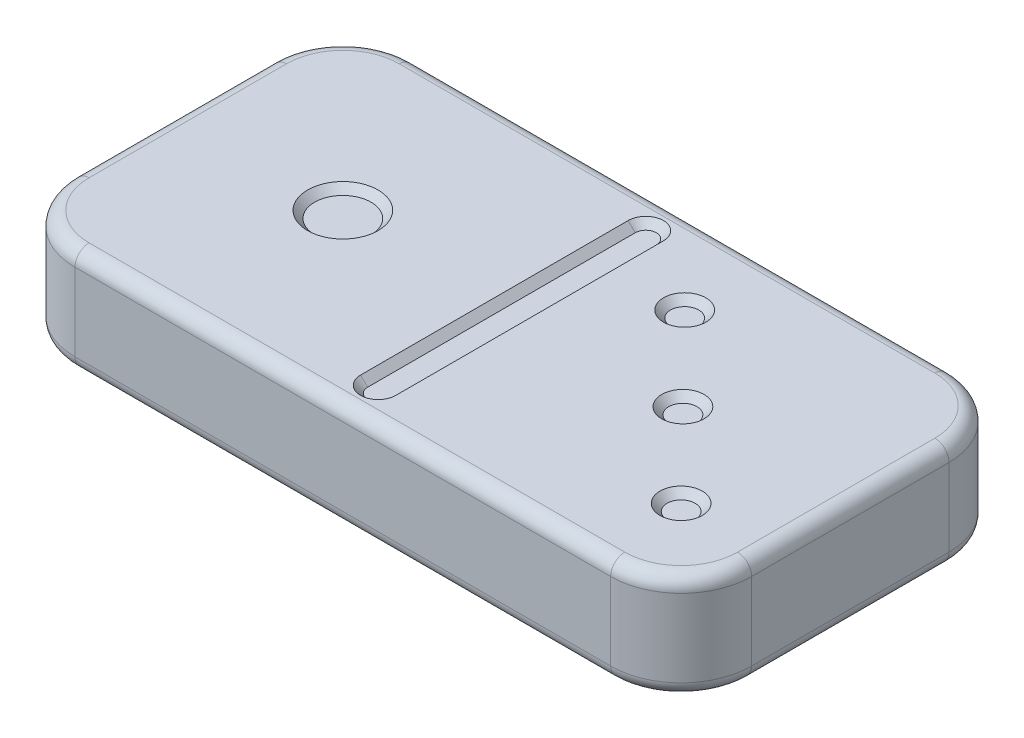
ISO-10303-21;
HEADER;
FILE_DESCRIPTION(('STEP AP214'),'2;1');
FILE_NAME('part.step','',(''),(''),'','','');
FILE_SCHEMA(('AUTOMOTIVE_DESIGN { 1 0 10303 214 1 1 1 1 }'));
ENDSEC;
DATA;
#1=APPLICATION_CONTEXT('core data for automotive mechanical design processes');
#2=APPLICATION_PROTOCOL_DEFINITION('international standard','automotive_design',2000,#1);
#3=PRODUCT_CONTEXT('',#1,'mechanical');
#4=PRODUCT('Part','Part','',(#3));
#5=PRODUCT_RELATED_PRODUCT_CATEGORY('part','',(#4));
#6=PRODUCT_DEFINITION_FORMATION('','',#4);
#7=PRODUCT_DEFINITION_CONTEXT('part definition',#1,'design');
#8=PRODUCT_DEFINITION('design','',#6,#7);
#9=PRODUCT_DEFINITION_SHAPE('','',#8);
#10=(LENGTH_UNIT() NAMED_UNIT(*) SI_UNIT(.MILLI.,.METRE.));
#11=(NAMED_UNIT(*) PLANE_ANGLE_UNIT() SI_UNIT($,.RADIAN.));
#12=(NAMED_UNIT(*) SI_UNIT($,.STERADIAN.) SOLID_ANGLE_UNIT());
#13=UNCERTAINTY_MEASURE_WITH_UNIT(LENGTH_MEASURE(1.E-05),#10,'distance_accuracy_value','');
#14=(GEOMETRIC_REPRESENTATION_CONTEXT(3) GLOBAL_UNCERTAINTY_ASSIGNED_CONTEXT((#13)) GLOBAL_UNIT_ASSIGNED_CONTEXT((#10,
#11,#12)) REPRESENTATION_CONTEXT('',''));
#15=CARTESIAN_POINT('',(0.,0.,0.));
#16=DIRECTION('',(0.,0.,1.));
#17=DIRECTION('',(1.,0.,0.));
#18=AXIS2_PLACEMENT_3D('',#15,#16,#17);
#19=CARTESIAN_POINT('',(0.,7.5,0.));
#20=DIRECTION('',(1.,0.,0.));
#21=DIRECTION('',(0.,0.,-1.));
#22=AXIS2_PLACEMENT_3D('',#19,#20,#21);
#23=PLANE('',#22);
#24=DIRECTION('',(0.,-1.,0.));
#25=VECTOR('',#24,1.);
#26=CARTESIAN_POINT('',(0.,7.5,-19.));
#27=LINE('',#26,#25);
#28=CARTESIAN_POINT('',(0.,6.5,-19.));
#29=VERTEX_POINT('',#28);
#30=CARTESIAN_POINT('',(0.,1.,-19.));
#31=VERTEX_POINT('',#30);
#32=EDGE_CURVE('E810',#29,#31,#27,.T.);
#33=ORIENTED_EDGE('',*,*,#32,.T.);
#34=DIRECTION('',(0.,0.,1.));
#35=VECTOR('',#34,1.);
#36=CARTESIAN_POINT('',(0.,1.,-5.));
#37=LINE('',#36,#35);
#38=CARTESIAN_POINT('',(0.,1.,-5.));
#39=VERTEX_POINT('',#38);
#40=EDGE_CURVE('E300',#31,#39,#37,.T.);
#41=ORIENTED_EDGE('',*,*,#40,.T.);
#42=DIRECTION('',(0.,-1.,0.));
#43=VECTOR('',#42,1.);
#44=CARTESIAN_POINT('',(0.,7.5,-5.));
#45=LINE('',#44,#43);
#46=CARTESIAN_POINT('',(0.,6.5,-5.));
#47=VERTEX_POINT('',#46);
#48=EDGE_CURVE('E195',#39,#47,#45,.F.);
#49=ORIENTED_EDGE('',*,*,#48,.T.);
#50=DIRECTION('',(0.,0.,1.));
#51=VECTOR('',#50,1.);
#52=CARTESIAN_POINT('',(0.,6.5,0.));
#53=LINE('',#52,#51);
#54=EDGE_CURVE('E224',#47,#29,#53,.F.);
#55=ORIENTED_EDGE('',*,*,#54,.T.);
#56=EDGE_LOOP('',(#33,#41,#49,#55));
#57=FACE_BOUND('',#56,.T.);
#58=ADVANCED_FACE('F37',(#57),#23,.F.);
#59=CARTESIAN_POINT('',(0.,7.5,0.));
#60=DIRECTION('',(0.,0.,-1.));
#61=DIRECTION('',(-1.,0.,0.));
#62=AXIS2_PLACEMENT_3D('',#59,#60,#61);
#63=PLANE('',#62);
#64=DIRECTION('',(0.,-1.,0.));
#65=VECTOR('',#64,1.);
#66=CARTESIAN_POINT('',(5.,7.5,0.));
#67=LINE('',#66,#65);
#68=CARTESIAN_POINT('',(5.,6.5,0.));
#69=VERTEX_POINT('',#68);
#70=CARTESIAN_POINT('',(5.,1.,0.));
#71=VERTEX_POINT('',#70);
#72=EDGE_CURVE('E796',#69,#71,#67,.T.);
#73=ORIENTED_EDGE('',*,*,#72,.T.);
#74=DIRECTION('',(1.,0.,0.));
#75=VECTOR('',#74,1.);
#76=CARTESIAN_POINT('',(43.,1.,0.));
#77=LINE('',#76,#75);
#78=CARTESIAN_POINT('',(43.,1.,0.));
#79=VERTEX_POINT('',#78);
#80=EDGE_CURVE('E294',#71,#79,#77,.T.);
#81=ORIENTED_EDGE('',*,*,#80,.T.);
#82=DIRECTION('',(0.,-1.,0.));
#83=VECTOR('',#82,1.);
#84=CARTESIAN_POINT('',(43.,7.5,0.));
#85=LINE('',#84,#83);
#86=CARTESIAN_POINT('',(43.,6.5,0.));
#87=VERTEX_POINT('',#86);
#88=EDGE_CURVE('E800',#79,#87,#85,.F.);
#89=ORIENTED_EDGE('',*,*,#88,.T.);
#90=DIRECTION('',(1.,0.,0.));
#91=VECTOR('',#90,1.);
#92=CARTESIAN_POINT('',(0.,6.5,0.));
#93=LINE('',#92,#91);
#94=EDGE_CURVE('E217',#87,#69,#93,.F.);
#95=ORIENTED_EDGE('',*,*,#94,.T.);
#96=EDGE_LOOP('',(#73,#81,#89,#95));
#97=FACE_BOUND('',#96,.T.);
#98=ADVANCED_FACE('F403',(#97),#63,.F.);
#99=CARTESIAN_POINT('',(48.,7.5,0.));
#100=DIRECTION('',(-1.,0.,0.));
#101=DIRECTION('',(0.,0.,1.));
#102=AXIS2_PLACEMENT_3D('',#99,#100,#101);
#103=PLANE('',#102);
#104=DIRECTION('',(0.,-1.,0.));
#105=VECTOR('',#104,1.);
#106=CARTESIAN_POINT('',(48.,7.5,-5.));
#107=LINE('',#106,#105);
#108=CARTESIAN_POINT('',(48.,6.5,-5.));
#109=VERTEX_POINT('',#108);
#110=CARTESIAN_POINT('',(48.,1.,-5.));
#111=VERTEX_POINT('',#110);
#112=EDGE_CURVE('E793',#109,#111,#107,.T.);
#113=ORIENTED_EDGE('',*,*,#112,.T.);
#114=DIRECTION('',(0.,0.,-1.));
#115=VECTOR('',#114,1.);
#116=CARTESIAN_POINT('',(48.,1.,-19.));
#117=LINE('',#116,#115);
#118=CARTESIAN_POINT('',(48.,1.,-19.));
#119=VERTEX_POINT('',#118);
#120=EDGE_CURVE('E288',#111,#119,#117,.T.);
#121=ORIENTED_EDGE('',*,*,#120,.T.);
#122=DIRECTION('',(0.,-1.,0.));
#123=VECTOR('',#122,1.);
#124=CARTESIAN_POINT('',(48.,7.5,-19.));
#125=LINE('',#124,#123);
#126=CARTESIAN_POINT('',(48.,6.5,-19.));
#127=VERTEX_POINT('',#126);
#128=EDGE_CURVE('E259',#119,#127,#125,.F.);
#129=ORIENTED_EDGE('',*,*,#128,.T.);
#130=DIRECTION('',(0.,0.,-1.));
#131=VECTOR('',#130,1.);
#132=CARTESIAN_POINT('',(48.,6.5,0.));
#133=LINE('',#132,#131);
#134=EDGE_CURVE('E205',#127,#109,#133,.F.);
#135=ORIENTED_EDGE('',*,*,#134,.T.);
#136=EDGE_LOOP('',(#113,#121,#129,#135));
#137=FACE_BOUND('',#136,.T.);
#138=ADVANCED_FACE('F409',(#137),#103,.F.);
#139=CARTESIAN_POINT('',(0.,7.5,-24.));
#140=DIRECTION('',(0.,0.,1.));
#141=DIRECTION('',(1.,0.,0.));
#142=AXIS2_PLACEMENT_3D('',#139,#140,#141);
#143=PLANE('',#142);
#144=DIRECTION('',(0.,-1.,0.));
#145=VECTOR('',#144,1.);
#146=CARTESIAN_POINT('',(43.,7.5,-24.));
#147=LINE('',#146,#145);
#148=CARTESIAN_POINT('',(43.,6.5,-24.));
#149=VERTEX_POINT('',#148);
#150=CARTESIAN_POINT('',(43.,1.,-24.));
#151=VERTEX_POINT('',#150);
#152=EDGE_CURVE('E806',#149,#151,#147,.T.);
#153=ORIENTED_EDGE('',*,*,#152,.T.);
#154=DIRECTION('',(-1.,0.,0.));
#155=VECTOR('',#154,1.);
#156=CARTESIAN_POINT('',(4.99999999999999,1.,-24.));
#157=LINE('',#156,#155);
#158=CARTESIAN_POINT('',(4.99999999999999,1.,-24.));
#159=VERTEX_POINT('',#158);
#160=EDGE_CURVE('E306',#151,#159,#157,.T.);
#161=ORIENTED_EDGE('',*,*,#160,.T.);
#162=DIRECTION('',(0.,-1.,0.));
#163=VECTOR('',#162,1.);
#164=CARTESIAN_POINT('',(4.99999999999999,7.5,-24.));
#165=LINE('',#164,#163);
#166=CARTESIAN_POINT('',(4.99999999999999,6.5,-24.));
#167=VERTEX_POINT('',#166);
#168=EDGE_CURVE('E803',#159,#167,#165,.F.);
#169=ORIENTED_EDGE('',*,*,#168,.T.);
#170=DIRECTION('',(-1.,0.,0.));
#171=VECTOR('',#170,1.);
#172=CARTESIAN_POINT('',(0.,6.5,-24.));
#173=LINE('',#172,#171);
#174=EDGE_CURVE('E231',#167,#149,#173,.F.);
#175=ORIENTED_EDGE('',*,*,#174,.T.);
#176=EDGE_LOOP('',(#153,#161,#169,#175));
#177=FACE_BOUND('',#176,.T.);
#178=ADVANCED_FACE('F688',(#177),#143,.F.);
#179=CARTESIAN_POINT('',(0.,7.5,-24.));
#180=DIRECTION('',(0.,-1.,0.));
#181=DIRECTION('',(0.,0.,-1.));
#182=AXIS2_PLACEMENT_3D('',#179,#180,#181);
#183=PLANE('',#182);
#184=CARTESIAN_POINT('',(12.,7.5,-12.));
#185=DIRECTION('',(0.,1.,0.));
#186=DIRECTION('',(0.,0.,1.));
#187=AXIS2_PLACEMENT_3D('',#184,#185,#186);
#188=CIRCLE('',#187,2.5);
#189=CARTESIAN_POINT('',(12.,7.5,-9.5));
#190=VERTEX_POINT('',#189);
#191=EDGE_CURVE('E767',#190,#190,#188,.T.);
#192=ORIENTED_EDGE('',*,*,#191,.F.);
#193=EDGE_LOOP('',(#192));
#194=FACE_BOUND('',#193,.T.);
#195=CARTESIAN_POINT('',(42.,7.5,-6.));
#196=DIRECTION('',(0.,1.,0.));
#197=DIRECTION('',(0.,0.,1.));
#198=AXIS2_PLACEMENT_3D('',#195,#196,#197);
#199=CIRCLE('',#198,1.5);
#200=CARTESIAN_POINT('',(42.,7.5,-4.5));
#201=VERTEX_POINT('',#200);
#202=EDGE_CURVE('E771',#201,#201,#199,.T.);
#203=ORIENTED_EDGE('',*,*,#202,.F.);
#204=EDGE_LOOP('',(#203));
#205=FACE_BOUND('',#204,.T.);
#206=CARTESIAN_POINT('',(36.125,7.5,-12.));
#207=DIRECTION('',(0.,1.,0.));
#208=DIRECTION('',(0.,0.,1.));
#209=AXIS2_PLACEMENT_3D('',#206,#207,#208);
#210=CIRCLE('',#209,1.5);
#211=CARTESIAN_POINT('',(36.125,7.5,-10.5));
#212=VERTEX_POINT('',#211);
#213=EDGE_CURVE('E775',#212,#212,#210,.T.);
#214=ORIENTED_EDGE('',*,*,#213,.F.);
#215=EDGE_LOOP('',(#214));
#216=FACE_BOUND('',#215,.T.);
#217=CARTESIAN_POINT('',(30.25,7.5,-18.));
#218=DIRECTION('',(0.,1.,0.));
#219=DIRECTION('',(0.,0.,1.));
#220=AXIS2_PLACEMENT_3D('',#217,#218,#219);
#221=CIRCLE('',#220,1.5);
#222=CARTESIAN_POINT('',(30.25,7.5,-16.5));
#223=VERTEX_POINT('',#222);
#224=EDGE_CURVE('E778',#223,#223,#221,.T.);
#225=ORIENTED_EDGE('',*,*,#224,.F.);
#226=EDGE_LOOP('',(#225));
#227=FACE_BOUND('',#226,.T.);
#228=DIRECTION('',(0.,0.,-1.));
#229=VECTOR('',#228,1.);
#230=CARTESIAN_POINT('',(22.75,7.5,-24.));
#231=LINE('',#230,#229);
#232=CARTESIAN_POINT('',(22.75,7.5,-2.5085750787772));
#233=VERTEX_POINT('',#232);
#234=CARTESIAN_POINT('',(22.75,7.5,-21.4914249212228));
#235=VERTEX_POINT('',#234);
#236=EDGE_CURVE('E309',#233,#235,#231,.T.);
#237=ORIENTED_EDGE('',*,*,#236,.T.);
#238=CARTESIAN_POINT('',(24.,7.5,-21.4914249212228));
#239=DIRECTION('',(0.,-1.,0.));
#240=DIRECTION('',(0.,0.,-1.));
#241=AXIS2_PLACEMENT_3D('',#238,#239,#240);
#242=CIRCLE('',#241,1.25000000000001);
#243=CARTESIAN_POINT('',(25.25,7.5,-21.4914249212228));
#244=VERTEX_POINT('',#243);
#245=EDGE_CURVE('E347',#235,#244,#242,.T.);
#246=ORIENTED_EDGE('',*,*,#245,.T.);
#247=DIRECTION('',(0.,0.,1.));
#248=VECTOR('',#247,1.);
#249=CARTESIAN_POINT('',(25.25,7.5,-24.));
#250=LINE('',#249,#248);
#251=CARTESIAN_POINT('',(25.25,7.5,-2.5085750787772));
#252=VERTEX_POINT('',#251);
#253=EDGE_CURVE('E344',#244,#252,#250,.T.);
#254=ORIENTED_EDGE('',*,*,#253,.T.);
#255=CARTESIAN_POINT('',(24.,7.5,-2.5085750787772));
#256=DIRECTION('',(0.,-1.,0.));
#257=DIRECTION('',(0.,0.,-1.));
#258=AXIS2_PLACEMENT_3D('',#255,#256,#257);
#259=CIRCLE('',#258,1.25000000000001);
#260=EDGE_CURVE('E341',#252,#233,#259,.T.);
#261=ORIENTED_EDGE('',*,*,#260,.T.);
#262=EDGE_LOOP('',(#237,#246,#254,#261));
#263=FACE_BOUND('',#262,.T.);
#264=DIRECTION('',(0.,0.,-1.));
#265=VECTOR('',#264,1.);
#266=CARTESIAN_POINT('',(47.,7.5,-24.));
#267=LINE('',#266,#265);
#268=CARTESIAN_POINT('',(47.,7.5,-5.));
#269=VERTEX_POINT('',#268);
#270=CARTESIAN_POINT('',(47.,7.5,-19.));
#271=VERTEX_POINT('',#270);
#272=EDGE_CURVE('E199',#269,#271,#267,.T.);
#273=ORIENTED_EDGE('',*,*,#272,.T.);
#274=CARTESIAN_POINT('',(43.,7.5,-19.));
#275=DIRECTION('',(0.,-1.,0.));
#276=DIRECTION('',(0.,0.,-1.));
#277=AXIS2_PLACEMENT_3D('',#274,#275,#276);
#278=CIRCLE('',#277,4.);
#279=CARTESIAN_POINT('',(43.,7.5,-23.));
#280=VERTEX_POINT('',#279);
#281=EDGE_CURVE('E177',#271,#280,#278,.F.);
#282=ORIENTED_EDGE('',*,*,#281,.T.);
#283=DIRECTION('',(-1.,0.,0.));
#284=VECTOR('',#283,1.);
#285=CARTESIAN_POINT('',(0.,7.5,-23.));
#286=LINE('',#285,#284);
#287=CARTESIAN_POINT('',(4.99999999999999,7.5,-23.));
#288=VERTEX_POINT('',#287);
#289=EDGE_CURVE('E187',#280,#288,#286,.T.);
#290=ORIENTED_EDGE('',*,*,#289,.T.);
#291=CARTESIAN_POINT('',(4.99999999999999,7.5,-19.));
#292=DIRECTION('',(0.,-1.,0.));
#293=DIRECTION('',(0.,0.,-1.));
#294=AXIS2_PLACEMENT_3D('',#291,#292,#293);
#295=CIRCLE('',#294,4.);
#296=CARTESIAN_POINT('',(0.999999999999989,7.5,-19.));
#297=VERTEX_POINT('',#296);
#298=EDGE_CURVE('E194',#288,#297,#295,.F.);
#299=ORIENTED_EDGE('',*,*,#298,.T.);
#300=DIRECTION('',(0.,0.,1.));
#301=VECTOR('',#300,1.);
#302=CARTESIAN_POINT('',(0.999999999999986,7.5,-24.));
#303=LINE('',#302,#301);
#304=CARTESIAN_POINT('',(0.999999999999997,7.5,-5.));
#305=VERTEX_POINT('',#304);
#306=EDGE_CURVE('E817',#297,#305,#303,.T.);
#307=ORIENTED_EDGE('',*,*,#306,.T.);
#308=CARTESIAN_POINT('',(5.,7.5,-5.));
#309=DIRECTION('',(0.,-1.,0.));
#310=DIRECTION('',(0.,0.,-1.));
#311=AXIS2_PLACEMENT_3D('',#308,#309,#310);
#312=CIRCLE('',#311,4.);
#313=CARTESIAN_POINT('',(5.,7.5,-1.));
#314=VERTEX_POINT('',#313);
#315=EDGE_CURVE('E820',#305,#314,#312,.F.);
#316=ORIENTED_EDGE('',*,*,#315,.T.);
#317=DIRECTION('',(1.,0.,0.));
#318=VECTOR('',#317,1.);
#319=CARTESIAN_POINT('',(0.,7.5,-1.));
#320=LINE('',#319,#318);
#321=CARTESIAN_POINT('',(43.,7.5,-1.));
#322=VERTEX_POINT('',#321);
#323=EDGE_CURVE('E823',#314,#322,#320,.T.);
#324=ORIENTED_EDGE('',*,*,#323,.T.);
#325=CARTESIAN_POINT('',(43.,7.5,-5.));
#326=DIRECTION('',(0.,-1.,0.));
#327=DIRECTION('',(0.,0.,-1.));
#328=AXIS2_PLACEMENT_3D('',#325,#326,#327);
#329=CIRCLE('',#328,4.);
#330=EDGE_CURVE('E207',#322,#269,#329,.F.);
#331=ORIENTED_EDGE('',*,*,#330,.T.);
#332=EDGE_LOOP('',(#273,#282,#290,#299,#307,#316,#324,#331));
#333=FACE_BOUND('',#332,.T.);
#334=ADVANCED_FACE('F197',(#194,#205,#216,#227,#263,#333),#183,.F.);
#335=CARTESIAN_POINT('',(0.,0.,-24.));
#336=DIRECTION('',(0.,-1.,0.));
#337=DIRECTION('',(0.,0.,-1.));
#338=AXIS2_PLACEMENT_3D('',#335,#336,#337);
#339=PLANE('',#338);
#340=DIRECTION('',(-1.,0.,0.));
#341=VECTOR('',#340,1.);
#342=CARTESIAN_POINT('',(43.,0.,-23.));
#343=LINE('',#342,#341);
#344=CARTESIAN_POINT('',(4.99999999999999,0.,-23.));
#345=VERTEX_POINT('',#344);
#346=CARTESIAN_POINT('',(43.,0.,-23.));
#347=VERTEX_POINT('',#346);
#348=EDGE_CURVE('E233',#345,#347,#343,.F.);
#349=ORIENTED_EDGE('',*,*,#348,.T.);
#350=CARTESIAN_POINT('',(43.,0.,-19.));
#351=DIRECTION('',(0.,-1.,0.));
#352=DIRECTION('',(0.,0.,-1.));
#353=AXIS2_PLACEMENT_3D('',#350,#351,#352);
#354=CIRCLE('',#353,4.);
#355=CARTESIAN_POINT('',(47.,0.,-19.));
#356=VERTEX_POINT('',#355);
#357=EDGE_CURVE('E280',#347,#356,#354,.T.);
#358=ORIENTED_EDGE('',*,*,#357,.T.);
#359=DIRECTION('',(0.,0.,-1.));
#360=VECTOR('',#359,1.);
#361=CARTESIAN_POINT('',(47.,0.,-5.));
#362=LINE('',#361,#360);
#363=CARTESIAN_POINT('',(47.,0.,-5.));
#364=VERTEX_POINT('',#363);
#365=EDGE_CURVE('E277',#356,#364,#362,.F.);
#366=ORIENTED_EDGE('',*,*,#365,.T.);
#367=CARTESIAN_POINT('',(43.,0.,-5.));
#368=DIRECTION('',(0.,-1.,0.));
#369=DIRECTION('',(0.,0.,-1.));
#370=AXIS2_PLACEMENT_3D('',#367,#368,#369);
#371=CIRCLE('',#370,4.);
#372=CARTESIAN_POINT('',(43.,0.,-1.));
#373=VERTEX_POINT('',#372);
#374=EDGE_CURVE('E274',#364,#373,#371,.T.);
#375=ORIENTED_EDGE('',*,*,#374,.T.);
#376=DIRECTION('',(1.,0.,0.));
#377=VECTOR('',#376,1.);
#378=CARTESIAN_POINT('',(5.,0.,-1.));
#379=LINE('',#378,#377);
#380=CARTESIAN_POINT('',(5.,0.,-1.));
#381=VERTEX_POINT('',#380);
#382=EDGE_CURVE('E271',#373,#381,#379,.F.);
#383=ORIENTED_EDGE('',*,*,#382,.T.);
#384=CARTESIAN_POINT('',(5.,0.,-5.));
#385=DIRECTION('',(0.,-1.,0.));
#386=DIRECTION('',(0.,0.,-1.));
#387=AXIS2_PLACEMENT_3D('',#384,#385,#386);
#388=CIRCLE('',#387,4.);
#389=CARTESIAN_POINT('',(0.999999999999997,0.,-5.));
#390=VERTEX_POINT('',#389);
#391=EDGE_CURVE('E268',#381,#390,#388,.T.);
#392=ORIENTED_EDGE('',*,*,#391,.T.);
#393=DIRECTION('',(0.,0.,1.));
#394=VECTOR('',#393,1.);
#395=CARTESIAN_POINT('',(0.999999999999989,0.,-19.));
#396=LINE('',#395,#394);
#397=CARTESIAN_POINT('',(0.999999999999989,0.,-19.));
#398=VERTEX_POINT('',#397);
#399=EDGE_CURVE('E265',#390,#398,#396,.F.);
#400=ORIENTED_EDGE('',*,*,#399,.T.);
#401=CARTESIAN_POINT('',(4.99999999999999,0.,-19.));
#402=DIRECTION('',(0.,-1.,0.));
#403=DIRECTION('',(0.,0.,-1.));
#404=AXIS2_PLACEMENT_3D('',#401,#402,#403);
#405=CIRCLE('',#404,4.);
#406=EDGE_CURVE('E262',#398,#345,#405,.T.);
#407=ORIENTED_EDGE('',*,*,#406,.T.);
#408=EDGE_LOOP('',(#349,#358,#366,#375,#383,#392,#400,#407));
#409=FACE_BOUND('',#408,.T.);
#410=ADVANCED_FACE('F419',(#409),#339,.T.);
#411=CARTESIAN_POINT('',(43.,7.5,-5.));
#412=DIRECTION('',(0.,-1.,0.));
#413=DIRECTION('',(0.,0.,-1.));
#414=AXIS2_PLACEMENT_3D('',#411,#412,#413);
#415=CYLINDRICAL_SURFACE('',#414,5.);
#416=ORIENTED_EDGE('',*,*,#88,.F.);
#417=CARTESIAN_POINT('',(43.,1.,-5.));
#418=DIRECTION('',(0.,-1.,0.));
#419=DIRECTION('',(0.,0.,-1.));
#420=AXIS2_PLACEMENT_3D('',#417,#418,#419);
#421=CIRCLE('',#420,5.);
#422=EDGE_CURVE('E291',#79,#111,#421,.F.);
#423=ORIENTED_EDGE('',*,*,#422,.T.);
#424=ORIENTED_EDGE('',*,*,#112,.F.);
#425=CARTESIAN_POINT('',(43.,6.5,-5.));
#426=DIRECTION('',(0.,-1.,0.));
#427=DIRECTION('',(0.,0.,-1.));
#428=AXIS2_PLACEMENT_3D('',#425,#426,#427);
#429=CIRCLE('',#428,5.);
#430=EDGE_CURVE('E213',#109,#87,#429,.T.);
#431=ORIENTED_EDGE('',*,*,#430,.T.);
#432=EDGE_LOOP('',(#416,#423,#424,#431));
#433=FACE_BOUND('',#432,.T.);
#434=ADVANCED_FACE('F415',(#433),#415,.T.);
#435=CARTESIAN_POINT('',(43.,7.5,-19.));
#436=DIRECTION('',(0.,-1.,0.));
#437=DIRECTION('',(0.,0.,-1.));
#438=AXIS2_PLACEMENT_3D('',#435,#436,#437);
#439=CYLINDRICAL_SURFACE('',#438,5.);
#440=ORIENTED_EDGE('',*,*,#128,.F.);
#441=CARTESIAN_POINT('',(43.,1.,-19.));
#442=DIRECTION('',(0.,-1.,0.));
#443=DIRECTION('',(0.,0.,-1.));
#444=AXIS2_PLACEMENT_3D('',#441,#442,#443);
#445=CIRCLE('',#444,5.);
#446=EDGE_CURVE('E284',#119,#151,#445,.F.);
#447=ORIENTED_EDGE('',*,*,#446,.T.);
#448=ORIENTED_EDGE('',*,*,#152,.F.);
#449=CARTESIAN_POINT('',(43.,6.5,-19.));
#450=DIRECTION('',(0.,-1.,0.));
#451=DIRECTION('',(0.,0.,-1.));
#452=AXIS2_PLACEMENT_3D('',#449,#450,#451);
#453=CIRCLE('',#452,5.);
#454=EDGE_CURVE('E179',#149,#127,#453,.T.);
#455=ORIENTED_EDGE('',*,*,#454,.T.);
#456=EDGE_LOOP('',(#440,#447,#448,#455));
#457=FACE_BOUND('',#456,.T.);
#458=ADVANCED_FACE('F418',(#457),#439,.T.);
#459=CARTESIAN_POINT('',(5.,7.5,-5.));
#460=DIRECTION('',(0.,-1.,0.));
#461=DIRECTION('',(0.,0.,-1.));
#462=AXIS2_PLACEMENT_3D('',#459,#460,#461);
#463=CYLINDRICAL_SURFACE('',#462,5.);
#464=ORIENTED_EDGE('',*,*,#48,.F.);
#465=CARTESIAN_POINT('',(5.,1.,-5.));
#466=DIRECTION('',(0.,-1.,0.));
#467=DIRECTION('',(0.,0.,-1.));
#468=AXIS2_PLACEMENT_3D('',#465,#466,#467);
#469=CIRCLE('',#468,5.);
#470=EDGE_CURVE('E297',#39,#71,#469,.F.);
#471=ORIENTED_EDGE('',*,*,#470,.T.);
#472=ORIENTED_EDGE('',*,*,#72,.F.);
#473=CARTESIAN_POINT('',(5.,6.5,-5.));
#474=DIRECTION('',(0.,-1.,0.));
#475=DIRECTION('',(0.,0.,-1.));
#476=AXIS2_PLACEMENT_3D('',#473,#474,#475);
#477=CIRCLE('',#476,5.);
#478=EDGE_CURVE('E220',#69,#47,#477,.T.);
#479=ORIENTED_EDGE('',*,*,#478,.T.);
#480=EDGE_LOOP('',(#464,#471,#472,#479));
#481=FACE_BOUND('',#480,.T.);
#482=ADVANCED_FACE('F423',(#481),#463,.T.);
#483=CARTESIAN_POINT('',(4.99999999999999,7.5,-19.));
#484=DIRECTION('',(0.,-1.,0.));
#485=DIRECTION('',(0.,0.,-1.));
#486=AXIS2_PLACEMENT_3D('',#483,#484,#485);
#487=CYLINDRICAL_SURFACE('',#486,5.);
#488=ORIENTED_EDGE('',*,*,#168,.F.);
#489=CARTESIAN_POINT('',(4.99999999999999,1.,-19.));
#490=DIRECTION('',(0.,-1.,0.));
#491=DIRECTION('',(0.,0.,-1.));
#492=AXIS2_PLACEMENT_3D('',#489,#490,#491);
#493=CIRCLE('',#492,5.);
#494=EDGE_CURVE('E303',#159,#31,#493,.F.);
#495=ORIENTED_EDGE('',*,*,#494,.T.);
#496=ORIENTED_EDGE('',*,*,#32,.F.);
#497=CARTESIAN_POINT('',(4.99999999999999,6.5,-19.));
#498=DIRECTION('',(0.,-1.,0.));
#499=DIRECTION('',(0.,0.,-1.));
#500=AXIS2_PLACEMENT_3D('',#497,#498,#499);
#501=CIRCLE('',#500,5.);
#502=EDGE_CURVE('E227',#29,#167,#501,.T.);
#503=ORIENTED_EDGE('',*,*,#502,.T.);
#504=EDGE_LOOP('',(#488,#495,#496,#503));
#505=FACE_BOUND('',#504,.T.);
#506=ADVANCED_FACE('F427',(#505),#487,.T.);
#507=CARTESIAN_POINT('',(5.,6.5,-5.));
#508=DIRECTION('',(0.,-1.,0.));
#509=DIRECTION('',(0.,0.,-1.));
#510=AXIS2_PLACEMENT_3D('',#507,#508,#509);
#511=TOROIDAL_SURFACE('',#510,4.,1.);
#512=CARTESIAN_POINT('',(0.999999999999997,6.5,-5.));
#513=DIRECTION('',(0.,0.,-1.));
#514=DIRECTION('',(-1.,0.,0.));
#515=AXIS2_PLACEMENT_3D('',#512,#513,#514);
#516=CIRCLE('',#515,1.);
#517=EDGE_CURVE('E251',#47,#305,#516,.T.);
#518=ORIENTED_EDGE('',*,*,#517,.F.);
#519=ORIENTED_EDGE('',*,*,#478,.F.);
#520=CARTESIAN_POINT('',(5.,6.5,-1.));
#521=DIRECTION('',(1.,0.,0.));
#522=DIRECTION('',(0.,0.,-1.));
#523=AXIS2_PLACEMENT_3D('',#520,#521,#522);
#524=CIRCLE('',#523,1.);
#525=EDGE_CURVE('E255',#314,#69,#524,.T.);
#526=ORIENTED_EDGE('',*,*,#525,.F.);
#527=ORIENTED_EDGE('',*,*,#315,.F.);
#528=EDGE_LOOP('',(#518,#519,#526,#527));
#529=FACE_BOUND('',#528,.T.);
#530=ADVANCED_FACE('F431',(#529),#511,.T.);
#531=CARTESIAN_POINT('',(0.,6.5,-1.));
#532=DIRECTION('',(1.,0.,0.));
#533=DIRECTION('',(0.,0.,-1.));
#534=AXIS2_PLACEMENT_3D('',#531,#532,#533);
#535=CYLINDRICAL_SURFACE('',#534,1.);
#536=ORIENTED_EDGE('',*,*,#525,.T.);
#537=ORIENTED_EDGE('',*,*,#94,.F.);
#538=CARTESIAN_POINT('',(43.,6.5,-1.));
#539=DIRECTION('',(1.,0.,0.));
#540=DIRECTION('',(0.,0.,-1.));
#541=AXIS2_PLACEMENT_3D('',#538,#539,#540);
#542=CIRCLE('',#541,1.);
#543=EDGE_CURVE('E247',#322,#87,#542,.T.);
#544=ORIENTED_EDGE('',*,*,#543,.F.);
#545=ORIENTED_EDGE('',*,*,#323,.F.);
#546=EDGE_LOOP('',(#536,#537,#544,#545));
#547=FACE_BOUND('',#546,.T.);
#548=ADVANCED_FACE('F453',(#547),#535,.T.);
#549=CARTESIAN_POINT('',(0.999999999999986,6.5,-24.));
#550=DIRECTION('',(0.,0.,1.));
#551=DIRECTION('',(1.,0.,0.));
#552=AXIS2_PLACEMENT_3D('',#549,#550,#551);
#553=CYLINDRICAL_SURFACE('',#552,1.);
#554=ORIENTED_EDGE('',*,*,#517,.T.);
#555=ORIENTED_EDGE('',*,*,#306,.F.);
#556=CARTESIAN_POINT('',(0.999999999999989,6.5,-19.));
#557=DIRECTION('',(0.,0.,-1.));
#558=DIRECTION('',(-1.,0.,0.));
#559=AXIS2_PLACEMENT_3D('',#556,#557,#558);
#560=CIRCLE('',#559,1.);
#561=EDGE_CURVE('E243',#29,#297,#560,.T.);
#562=ORIENTED_EDGE('',*,*,#561,.F.);
#563=ORIENTED_EDGE('',*,*,#54,.F.);
#564=EDGE_LOOP('',(#554,#555,#562,#563));
#565=FACE_BOUND('',#564,.T.);
#566=ADVANCED_FACE('F449',(#565),#553,.T.);
#567=CARTESIAN_POINT('',(43.,6.5,-5.));
#568=DIRECTION('',(0.,-1.,0.));
#569=DIRECTION('',(0.,0.,-1.));
#570=AXIS2_PLACEMENT_3D('',#567,#568,#569);
#571=TOROIDAL_SURFACE('',#570,4.,1.);
#572=ORIENTED_EDGE('',*,*,#543,.T.);
#573=ORIENTED_EDGE('',*,*,#430,.F.);
#574=CARTESIAN_POINT('',(47.,6.5,-5.));
#575=DIRECTION('',(0.,0.,-1.));
#576=DIRECTION('',(-1.,0.,0.));
#577=AXIS2_PLACEMENT_3D('',#574,#575,#576);
#578=CIRCLE('',#577,1.);
#579=EDGE_CURVE('E239',#269,#109,#578,.T.);
#580=ORIENTED_EDGE('',*,*,#579,.F.);
#581=ORIENTED_EDGE('',*,*,#330,.F.);
#582=EDGE_LOOP('',(#572,#573,#580,#581));
#583=FACE_BOUND('',#582,.T.);
#584=ADVANCED_FACE('F445',(#583),#571,.T.);
#585=CARTESIAN_POINT('',(4.99999999999999,6.5,-19.));
#586=DIRECTION('',(0.,-1.,0.));
#587=DIRECTION('',(0.,0.,-1.));
#588=AXIS2_PLACEMENT_3D('',#585,#586,#587);
#589=TOROIDAL_SURFACE('',#588,4.,1.);
#590=ORIENTED_EDGE('',*,*,#561,.T.);
#591=ORIENTED_EDGE('',*,*,#298,.F.);
#592=CARTESIAN_POINT('',(4.99999999999999,6.5,-23.));
#593=DIRECTION('',(1.,0.,0.));
#594=DIRECTION('',(0.,0.,-1.));
#595=AXIS2_PLACEMENT_3D('',#592,#593,#594);
#596=CIRCLE('',#595,1.);
#597=EDGE_CURVE('E190',#167,#288,#596,.T.);
#598=ORIENTED_EDGE('',*,*,#597,.F.);
#599=ORIENTED_EDGE('',*,*,#502,.F.);
#600=EDGE_LOOP('',(#590,#591,#598,#599));
#601=FACE_BOUND('',#600,.T.);
#602=ADVANCED_FACE('F441',(#601),#589,.T.);
#603=CARTESIAN_POINT('',(47.,6.5,-24.));
#604=DIRECTION('',(0.,0.,-1.));
#605=DIRECTION('',(-1.,0.,0.));
#606=AXIS2_PLACEMENT_3D('',#603,#604,#605);
#607=CYLINDRICAL_SURFACE('',#606,1.);
#608=ORIENTED_EDGE('',*,*,#579,.T.);
#609=ORIENTED_EDGE('',*,*,#134,.F.);
#610=CARTESIAN_POINT('',(47.,6.5,-19.));
#611=DIRECTION('',(0.,0.,-1.));
#612=DIRECTION('',(-1.,0.,0.));
#613=AXIS2_PLACEMENT_3D('',#610,#611,#612);
#614=CIRCLE('',#613,1.);
#615=EDGE_CURVE('E183',#271,#127,#614,.T.);
#616=ORIENTED_EDGE('',*,*,#615,.F.);
#617=ORIENTED_EDGE('',*,*,#272,.F.);
#618=EDGE_LOOP('',(#608,#609,#616,#617));
#619=FACE_BOUND('',#618,.T.);
#620=ADVANCED_FACE('F438',(#619),#607,.T.);
#621=CARTESIAN_POINT('',(0.,6.5,-23.));
#622=DIRECTION('',(-1.,0.,0.));
#623=DIRECTION('',(0.,0.,1.));
#624=AXIS2_PLACEMENT_3D('',#621,#622,#623);
#625=CYLINDRICAL_SURFACE('',#624,1.);
#626=ORIENTED_EDGE('',*,*,#597,.T.);
#627=ORIENTED_EDGE('',*,*,#289,.F.);
#628=CARTESIAN_POINT('',(43.,6.5,-23.));
#629=DIRECTION('',(1.,0.,0.));
#630=DIRECTION('',(0.,0.,-1.));
#631=AXIS2_PLACEMENT_3D('',#628,#629,#630);
#632=CIRCLE('',#631,1.);
#633=EDGE_CURVE('E172',#149,#280,#632,.T.);
#634=ORIENTED_EDGE('',*,*,#633,.F.);
#635=ORIENTED_EDGE('',*,*,#174,.F.);
#636=EDGE_LOOP('',(#626,#627,#634,#635));
#637=FACE_BOUND('',#636,.T.);
#638=ADVANCED_FACE('F188',(#637),#625,.T.);
#639=CARTESIAN_POINT('',(43.,6.5,-19.));
#640=DIRECTION('',(0.,-1.,0.));
#641=DIRECTION('',(0.,0.,-1.));
#642=AXIS2_PLACEMENT_3D('',#639,#640,#641);
#643=TOROIDAL_SURFACE('',#642,4.,1.);
#644=ORIENTED_EDGE('',*,*,#615,.T.);
#645=ORIENTED_EDGE('',*,*,#454,.F.);
#646=ORIENTED_EDGE('',*,*,#633,.T.);
#647=ORIENTED_EDGE('',*,*,#281,.F.);
#648=EDGE_LOOP('',(#644,#645,#646,#647));
#649=FACE_BOUND('',#648,.T.);
#650=ADVANCED_FACE('F175',(#649),#643,.T.);
#651=CARTESIAN_POINT('',(5.,1.,-5.));
#652=DIRECTION('',(0.,-1.,0.));
#653=DIRECTION('',(0.,0.,-1.));
#654=AXIS2_PLACEMENT_3D('',#651,#652,#653);
#655=TOROIDAL_SURFACE('',#654,4.,1.);
#656=CARTESIAN_POINT('',(5.,1.,-1.));
#657=DIRECTION('',(1.,0.,0.));
#658=DIRECTION('',(0.,0.,-1.));
#659=AXIS2_PLACEMENT_3D('',#656,#657,#658);
#660=CIRCLE('',#659,1.);
#661=EDGE_CURVE('E332',#71,#381,#660,.T.);
#662=ORIENTED_EDGE('',*,*,#661,.F.);
#663=ORIENTED_EDGE('',*,*,#470,.F.);
#664=CARTESIAN_POINT('',(0.999999999999997,1.,-5.));
#665=DIRECTION('',(0.,0.,-1.));
#666=DIRECTION('',(-1.,0.,0.));
#667=AXIS2_PLACEMENT_3D('',#664,#665,#666);
#668=CIRCLE('',#667,1.);
#669=EDGE_CURVE('E184',#390,#39,#668,.T.);
#670=ORIENTED_EDGE('',*,*,#669,.F.);
#671=ORIENTED_EDGE('',*,*,#391,.F.);
#672=EDGE_LOOP('',(#662,#663,#670,#671));
#673=FACE_BOUND('',#672,.T.);
#674=ADVANCED_FACE('F435',(#673),#655,.T.);
#675=CARTESIAN_POINT('',(1.,1.,0.));
#676=DIRECTION('',(0.,0.,-1.));
#677=DIRECTION('',(-1.,0.,0.));
#678=AXIS2_PLACEMENT_3D('',#675,#676,#677);
#679=CYLINDRICAL_SURFACE('',#678,1.);
#680=ORIENTED_EDGE('',*,*,#669,.T.);
#681=ORIENTED_EDGE('',*,*,#40,.F.);
#682=CARTESIAN_POINT('',(0.999999999999989,1.,-19.));
#683=DIRECTION('',(0.,0.,-1.));
#684=DIRECTION('',(-1.,0.,0.));
#685=AXIS2_PLACEMENT_3D('',#682,#683,#684);
#686=CIRCLE('',#685,1.);
#687=EDGE_CURVE('E328',#398,#31,#686,.T.);
#688=ORIENTED_EDGE('',*,*,#687,.F.);
#689=ORIENTED_EDGE('',*,*,#399,.F.);
#690=EDGE_LOOP('',(#680,#681,#688,#689));
#691=FACE_BOUND('',#690,.T.);
#692=ADVANCED_FACE('F479',(#691),#679,.T.);
#693=CARTESIAN_POINT('',(0.,1.,-1.));
#694=DIRECTION('',(-1.,0.,0.));
#695=DIRECTION('',(0.,0.,1.));
#696=AXIS2_PLACEMENT_3D('',#693,#694,#695);
#697=CYLINDRICAL_SURFACE('',#696,1.);
#698=ORIENTED_EDGE('',*,*,#661,.T.);
#699=ORIENTED_EDGE('',*,*,#382,.F.);
#700=CARTESIAN_POINT('',(43.,1.,-1.));
#701=DIRECTION('',(1.,0.,0.));
#702=DIRECTION('',(0.,0.,-1.));
#703=AXIS2_PLACEMENT_3D('',#700,#701,#702);
#704=CIRCLE('',#703,1.);
#705=EDGE_CURVE('E324',#79,#373,#704,.T.);
#706=ORIENTED_EDGE('',*,*,#705,.F.);
#707=ORIENTED_EDGE('',*,*,#80,.F.);
#708=EDGE_LOOP('',(#698,#699,#706,#707));
#709=FACE_BOUND('',#708,.T.);
#710=ADVANCED_FACE('F475',(#709),#697,.T.);
#711=CARTESIAN_POINT('',(4.99999999999999,1.,-19.));
#712=DIRECTION('',(0.,-1.,0.));
#713=DIRECTION('',(0.,0.,-1.));
#714=AXIS2_PLACEMENT_3D('',#711,#712,#713);
#715=TOROIDAL_SURFACE('',#714,4.,1.);
#716=ORIENTED_EDGE('',*,*,#687,.T.);
#717=ORIENTED_EDGE('',*,*,#494,.F.);
#718=CARTESIAN_POINT('',(4.99999999999999,1.,-23.));
#719=DIRECTION('',(1.,0.,0.));
#720=DIRECTION('',(0.,0.,-1.));
#721=AXIS2_PLACEMENT_3D('',#718,#719,#720);
#722=CIRCLE('',#721,1.);
#723=EDGE_CURVE('E320',#345,#159,#722,.T.);
#724=ORIENTED_EDGE('',*,*,#723,.F.);
#725=ORIENTED_EDGE('',*,*,#406,.F.);
#726=EDGE_LOOP('',(#716,#717,#724,#725));
#727=FACE_BOUND('',#726,.T.);
#728=ADVANCED_FACE('F471',(#727),#715,.T.);
#729=CARTESIAN_POINT('',(43.,1.,-5.));
#730=DIRECTION('',(0.,-1.,0.));
#731=DIRECTION('',(0.,0.,-1.));
#732=AXIS2_PLACEMENT_3D('',#729,#730,#731);
#733=TOROIDAL_SURFACE('',#732,4.,1.);
#734=ORIENTED_EDGE('',*,*,#705,.T.);
#735=ORIENTED_EDGE('',*,*,#374,.F.);
#736=CARTESIAN_POINT('',(47.,1.,-5.));
#737=DIRECTION('',(0.,0.,-1.));
#738=DIRECTION('',(-1.,0.,0.));
#739=AXIS2_PLACEMENT_3D('',#736,#737,#738);
#740=CIRCLE('',#739,1.);
#741=EDGE_CURVE('E316',#111,#364,#740,.T.);
#742=ORIENTED_EDGE('',*,*,#741,.F.);
#743=ORIENTED_EDGE('',*,*,#422,.F.);
#744=EDGE_LOOP('',(#734,#735,#742,#743));
#745=FACE_BOUND('',#744,.T.);
#746=ADVANCED_FACE('F467',(#745),#733,.T.);
#747=CARTESIAN_POINT('',(0.,1.,-23.));
#748=DIRECTION('',(1.,0.,0.));
#749=DIRECTION('',(0.,0.,-1.));
#750=AXIS2_PLACEMENT_3D('',#747,#748,#749);
#751=CYLINDRICAL_SURFACE('',#750,1.);
#752=ORIENTED_EDGE('',*,*,#723,.T.);
#753=ORIENTED_EDGE('',*,*,#160,.F.);
#754=CARTESIAN_POINT('',(43.,1.,-23.));
#755=DIRECTION('',(1.,0.,0.));
#756=DIRECTION('',(0.,0.,-1.));
#757=AXIS2_PLACEMENT_3D('',#754,#755,#756);
#758=CIRCLE('',#757,1.);
#759=EDGE_CURVE('E313',#347,#151,#758,.T.);
#760=ORIENTED_EDGE('',*,*,#759,.F.);
#761=ORIENTED_EDGE('',*,*,#348,.F.);
#762=EDGE_LOOP('',(#752,#753,#760,#761));
#763=FACE_BOUND('',#762,.T.);
#764=ADVANCED_FACE('F463',(#763),#751,.T.);
#765=CARTESIAN_POINT('',(47.,1.,0.));
#766=DIRECTION('',(0.,0.,1.));
#767=DIRECTION('',(1.,0.,0.));
#768=AXIS2_PLACEMENT_3D('',#765,#766,#767);
#769=CYLINDRICAL_SURFACE('',#768,1.);
#770=ORIENTED_EDGE('',*,*,#741,.T.);
#771=ORIENTED_EDGE('',*,*,#365,.F.);
#772=CARTESIAN_POINT('',(47.,1.,-19.));
#773=DIRECTION('',(0.,0.,-1.));
#774=DIRECTION('',(-1.,0.,0.));
#775=AXIS2_PLACEMENT_3D('',#772,#773,#774);
#776=CIRCLE('',#775,1.);
#777=EDGE_CURVE('E310',#119,#356,#776,.T.);
#778=ORIENTED_EDGE('',*,*,#777,.F.);
#779=ORIENTED_EDGE('',*,*,#120,.F.);
#780=EDGE_LOOP('',(#770,#771,#778,#779));
#781=FACE_BOUND('',#780,.T.);
#782=ADVANCED_FACE('F397',(#781),#769,.T.);
#783=CARTESIAN_POINT('',(43.,1.,-19.));
#784=DIRECTION('',(0.,-1.,0.));
#785=DIRECTION('',(0.,0.,-1.));
#786=AXIS2_PLACEMENT_3D('',#783,#784,#785);
#787=TOROIDAL_SURFACE('',#786,4.,1.);
#788=ORIENTED_EDGE('',*,*,#759,.T.);
#789=ORIENTED_EDGE('',*,*,#446,.F.);
#790=ORIENTED_EDGE('',*,*,#777,.T.);
#791=ORIENTED_EDGE('',*,*,#357,.F.);
#792=EDGE_LOOP('',(#788,#789,#790,#791));
#793=FACE_BOUND('',#792,.T.);
#794=ADVANCED_FACE('F391',(#793),#787,.T.);
#795=CARTESIAN_POINT('',(24.25,7.,-2.5085750787772));
#796=DIRECTION('',(0.,1.,0.));
#797=DIRECTION('',(0.,0.,1.));
#798=AXIS2_PLACEMENT_3D('',#795,#796,#797);
#799=PLANE('',#798);
#800=CARTESIAN_POINT('',(24.,7.,-21.4914249212228));
#801=DIRECTION('',(0.,1.,0.));
#802=DIRECTION('',(0.,0.,1.));
#803=AXIS2_PLACEMENT_3D('',#800,#801,#802);
#804=CIRCLE('',#803,0.750000000000012);
#805=CARTESIAN_POINT('',(24.75,7.,-21.4914249212228));
#806=VERTEX_POINT('',#805);
#807=CARTESIAN_POINT('',(23.25,7.,-21.4914249212228));
#808=VERTEX_POINT('',#807);
#809=EDGE_CURVE('E351',#806,#808,#804,.T.);
#810=ORIENTED_EDGE('',*,*,#809,.T.);
#811=DIRECTION('',(0.,0.,-1.));
#812=VECTOR('',#811,1.);
#813=CARTESIAN_POINT('',(23.25,7.,-21.4914249212228));
#814=LINE('',#813,#812);
#815=CARTESIAN_POINT('',(23.25,7.,-2.50857507877721));
#816=VERTEX_POINT('',#815);
#817=EDGE_CURVE('E11',#808,#816,#814,.F.);
#818=ORIENTED_EDGE('',*,*,#817,.T.);
#819=CARTESIAN_POINT('',(24.,7.,-2.5085750787772));
#820=DIRECTION('',(0.,1.,0.));
#821=DIRECTION('',(0.,0.,1.));
#822=AXIS2_PLACEMENT_3D('',#819,#820,#821);
#823=CIRCLE('',#822,0.750000000000011);
#824=CARTESIAN_POINT('',(24.75,7.,-2.5085750787772));
#825=VERTEX_POINT('',#824);
#826=EDGE_CURVE('E48',#816,#825,#823,.T.);
#827=ORIENTED_EDGE('',*,*,#826,.T.);
#828=DIRECTION('',(0.,0.,1.));
#829=VECTOR('',#828,1.);
#830=CARTESIAN_POINT('',(24.75,7.,-21.4914249212228));
#831=LINE('',#830,#829);
#832=EDGE_CURVE('E354',#825,#806,#831,.F.);
#833=ORIENTED_EDGE('',*,*,#832,.T.);
#834=EDGE_LOOP('',(#810,#818,#827,#833));
#835=FACE_BOUND('',#834,.T.);
#836=ADVANCED_FACE('F389',(#835),#799,.T.);
#837=CARTESIAN_POINT('',(24.,6.49999999999998,-2.5085750787772));
#838=DIRECTION('',(0.,1.,0.));
#839=DIRECTION('',(0.,0.,1.));
#840=AXIS2_PLACEMENT_3D('',#837,#838,#839);
#841=CONICAL_SURFACE('',#840,0.25,0.785398163397443);
#842=DIRECTION('',(0.707106781186544,-0.707106781186551,0.));
#843=VECTOR('',#842,1.);
#844=CARTESIAN_POINT('',(22.75,7.5,-2.5085750787772));
#845=LINE('',#844,#843);
#846=EDGE_CURVE('E366',#233,#816,#845,.T.);
#847=ORIENTED_EDGE('',*,*,#846,.F.);
#848=ORIENTED_EDGE('',*,*,#260,.F.);
#849=DIRECTION('',(0.707106781186544,0.707106781186551,0.));
#850=VECTOR('',#849,1.);
#851=CARTESIAN_POINT('',(24.25,6.49999999999998,-2.5085750787772));
#852=LINE('',#851,#850);
#853=EDGE_CURVE('E41',#825,#252,#852,.T.);
#854=ORIENTED_EDGE('',*,*,#853,.F.);
#855=ORIENTED_EDGE('',*,*,#826,.F.);
#856=EDGE_LOOP('',(#847,#848,#854,#855));
#857=FACE_BOUND('',#856,.T.);
#858=ADVANCED_FACE('F39',(#857),#841,.F.);
#859=CARTESIAN_POINT('',(24.25,6.49999999999998,-21.4914249212228));
#860=DIRECTION('',(0.707106781186551,-0.707106781186544,0.));
#861=DIRECTION('',(0.707106781186544,0.707106781186551,0.));
#862=AXIS2_PLACEMENT_3D('',#859,#860,#861);
#863=PLANE('',#862);
#864=ORIENTED_EDGE('',*,*,#853,.T.);
#865=ORIENTED_EDGE('',*,*,#253,.F.);
#866=DIRECTION('',(0.707106781186544,0.707106781186551,0.));
#867=VECTOR('',#866,1.);
#868=CARTESIAN_POINT('',(24.25,6.49999999999998,-21.4914249212228));
#869=LINE('',#868,#867);
#870=EDGE_CURVE('E363',#806,#244,#869,.T.);
#871=ORIENTED_EDGE('',*,*,#870,.F.);
#872=ORIENTED_EDGE('',*,*,#832,.F.);
#873=EDGE_LOOP('',(#864,#865,#871,#872));
#874=FACE_BOUND('',#873,.T.);
#875=ADVANCED_FACE('F378',(#874),#863,.F.);
#876=CARTESIAN_POINT('',(23.75,6.49999999999998,-21.4914249212228));
#877=DIRECTION('',(-0.707106781186551,-0.707106781186544,0.));
#878=DIRECTION('',(0.707106781186544,-0.707106781186551,0.));
#879=AXIS2_PLACEMENT_3D('',#876,#877,#878);
#880=PLANE('',#879);
#881=ORIENTED_EDGE('',*,*,#846,.T.);
#882=ORIENTED_EDGE('',*,*,#817,.F.);
#883=DIRECTION('',(0.707106781186544,-0.707106781186551,0.));
#884=VECTOR('',#883,1.);
#885=CARTESIAN_POINT('',(22.75,7.5,-21.4914249212228));
#886=LINE('',#885,#884);
#887=EDGE_CURVE('E360',#235,#808,#886,.T.);
#888=ORIENTED_EDGE('',*,*,#887,.F.);
#889=ORIENTED_EDGE('',*,*,#236,.F.);
#890=EDGE_LOOP('',(#881,#882,#888,#889));
#891=FACE_BOUND('',#890,.T.);
#892=ADVANCED_FACE('F388',(#891),#880,.F.);
#893=CARTESIAN_POINT('',(24.,6.49999999999998,-21.4914249212228));
#894=DIRECTION('',(0.,1.,0.));
#895=DIRECTION('',(0.,0.,1.));
#896=AXIS2_PLACEMENT_3D('',#893,#894,#895);
#897=CONICAL_SURFACE('',#896,0.25,0.785398163397444);
#898=ORIENTED_EDGE('',*,*,#870,.T.);
#899=ORIENTED_EDGE('',*,*,#245,.F.);
#900=ORIENTED_EDGE('',*,*,#887,.T.);
#901=ORIENTED_EDGE('',*,*,#809,.F.);
#902=EDGE_LOOP('',(#898,#899,#900,#901));
#903=FACE_BOUND('',#902,.T.);
#904=ADVANCED_FACE('F386',(#903),#897,.F.);
#905=CARTESIAN_POINT('',(30.25,7.5,-18.));
#906=DIRECTION('',(0.,1.,0.));
#907=DIRECTION('',(0.,0.,1.));
#908=AXIS2_PLACEMENT_3D('',#905,#906,#907);
#909=CONICAL_SURFACE('',#908,1.5,0.78539816339745);
#910=CARTESIAN_POINT('',(30.25,7.,-18.));
#911=DIRECTION('',(0.,1.,0.));
#912=DIRECTION('',(0.,0.,1.));
#913=AXIS2_PLACEMENT_3D('',#910,#911,#912);
#914=CIRCLE('',#913,1.);
#915=CARTESIAN_POINT('',(30.25,7.,-17.));
#916=VERTEX_POINT('',#915);
#917=EDGE_CURVE('E364',#916,#916,#914,.T.);
#918=ORIENTED_EDGE('',*,*,#917,.F.);
#919=EDGE_LOOP('',(#918));
#920=FACE_BOUND('',#919,.T.);
#921=ORIENTED_EDGE('',*,*,#224,.T.);
#922=EDGE_LOOP('',(#921));
#923=FACE_BOUND('',#922,.T.);
#924=ADVANCED_FACE('F489',(#920,#923),#909,.F.);
#925=CARTESIAN_POINT('',(30.25,7.,-18.));
#926=DIRECTION('',(0.,1.,0.));
#927=DIRECTION('',(0.,0.,1.));
#928=AXIS2_PLACEMENT_3D('',#925,#926,#927);
#929=PLANE('',#928);
#930=ORIENTED_EDGE('',*,*,#917,.T.);
#931=EDGE_LOOP('',(#930));
#932=FACE_BOUND('',#931,.T.);
#933=ADVANCED_FACE('F510',(#932),#929,.T.);
#934=CARTESIAN_POINT('',(36.125,7.5,-12.));
#935=DIRECTION('',(0.,1.,0.));
#936=DIRECTION('',(0.,0.,1.));
#937=AXIS2_PLACEMENT_3D('',#934,#935,#936);
#938=CONICAL_SURFACE('',#937,1.5,0.78539816339745);
#939=CARTESIAN_POINT('',(36.125,7.,-12.));
#940=DIRECTION('',(0.,1.,0.));
#941=DIRECTION('',(0.,0.,1.));
#942=AXIS2_PLACEMENT_3D('',#939,#940,#941);
#943=CIRCLE('',#942,1.);
#944=CARTESIAN_POINT('',(36.125,7.,-11.));
#945=VERTEX_POINT('',#944);
#946=EDGE_CURVE('E781',#945,#945,#943,.T.);
#947=ORIENTED_EDGE('',*,*,#946,.F.);
#948=EDGE_LOOP('',(#947));
#949=FACE_BOUND('',#948,.T.);
#950=ORIENTED_EDGE('',*,*,#213,.T.);
#951=EDGE_LOOP('',(#950));
#952=FACE_BOUND('',#951,.T.);
#953=ADVANCED_FACE('F517',(#949,#952),#938,.F.);
#954=CARTESIAN_POINT('',(36.125,7.,-12.));
#955=DIRECTION('',(0.,1.,0.));
#956=DIRECTION('',(0.,0.,1.));
#957=AXIS2_PLACEMENT_3D('',#954,#955,#956);
#958=PLANE('',#957);
#959=ORIENTED_EDGE('',*,*,#946,.T.);
#960=EDGE_LOOP('',(#959));
#961=FACE_BOUND('',#960,.T.);
#962=ADVANCED_FACE('F525',(#961),#958,.T.);
#963=CARTESIAN_POINT('',(42.,7.5,-6.));
#964=DIRECTION('',(0.,1.,0.));
#965=DIRECTION('',(0.,0.,1.));
#966=AXIS2_PLACEMENT_3D('',#963,#964,#965);
#967=CONICAL_SURFACE('',#966,1.5,0.78539816339745);
#968=CARTESIAN_POINT('',(42.,7.,-6.));
#969=DIRECTION('',(0.,1.,0.));
#970=DIRECTION('',(0.,0.,1.));
#971=AXIS2_PLACEMENT_3D('',#968,#969,#970);
#972=CIRCLE('',#971,1.);
#973=CARTESIAN_POINT('',(42.,7.,-5.));
#974=VERTEX_POINT('',#973);
#975=EDGE_CURVE('E875',#974,#974,#972,.T.);
#976=ORIENTED_EDGE('',*,*,#975,.F.);
#977=EDGE_LOOP('',(#976));
#978=FACE_BOUND('',#977,.T.);
#979=ORIENTED_EDGE('',*,*,#202,.T.);
#980=EDGE_LOOP('',(#979));
#981=FACE_BOUND('',#980,.T.);
#982=ADVANCED_FACE('F533',(#978,#981),#967,.F.);
#983=CARTESIAN_POINT('',(42.,7.,-6.));
#984=DIRECTION('',(0.,1.,0.));
#985=DIRECTION('',(0.,0.,1.));
#986=AXIS2_PLACEMENT_3D('',#983,#984,#985);
#987=PLANE('',#986);
#988=ORIENTED_EDGE('',*,*,#975,.T.);
#989=EDGE_LOOP('',(#988));
#990=FACE_BOUND('',#989,.T.);
#991=ADVANCED_FACE('F541',(#990),#987,.T.);
#992=CARTESIAN_POINT('',(12.,7.5,-12.));
#993=DIRECTION('',(0.,1.,0.));
#994=DIRECTION('',(0.,0.,1.));
#995=AXIS2_PLACEMENT_3D('',#992,#993,#994);
#996=CONICAL_SURFACE('',#995,2.5,0.78539816339745);
#997=CARTESIAN_POINT('',(12.,7.,-12.));
#998=DIRECTION('',(0.,1.,0.));
#999=DIRECTION('',(0.,0.,1.));
#1000=AXIS2_PLACEMENT_3D('',#997,#998,#999);
#1001=CIRCLE('',#1000,2.);
#1002=CARTESIAN_POINT('',(12.,7.,-10.));
#1003=VERTEX_POINT('',#1002);
#1004=EDGE_CURVE('E881',#1003,#1003,#1001,.T.);
#1005=ORIENTED_EDGE('',*,*,#1004,.F.);
#1006=EDGE_LOOP('',(#1005));
#1007=FACE_BOUND('',#1006,.T.);
#1008=ORIENTED_EDGE('',*,*,#191,.T.);
#1009=EDGE_LOOP('',(#1008));
#1010=FACE_BOUND('',#1009,.T.);
#1011=ADVANCED_FACE('F549',(#1007,#1010),#996,.F.);
#1012=CARTESIAN_POINT('',(12.,7.,-12.));
#1013=DIRECTION('',(0.,1.,0.));
#1014=DIRECTION('',(0.,0.,1.));
#1015=AXIS2_PLACEMENT_3D('',#1012,#1013,#1014);
#1016=PLANE('',#1015);
#1017=ORIENTED_EDGE('',*,*,#1004,.T.);
#1018=EDGE_LOOP('',(#1017));
#1019=FACE_BOUND('',#1018,.T.);
#1020=ADVANCED_FACE('F558',(#1019),#1016,.T.);
#1021=CLOSED_SHELL('',(#58,#98,#138,#178,#334,#410,#434,#458,#482,#506,#530,#548,#566,#584,#602,
#620,#638,#650,#674,#692,#710,#728,#746,#764,#782,#794,#836,#858,#875,#892,#904,#924,#933,#953,
#962,#982,#991,#1011,#1020));
#1022=MANIFOLD_SOLID_BREP('B2',#1021);
#1023=ADVANCED_BREP_SHAPE_REPRESENTATION('',(#18,#1022),#14);
#1024=SHAPE_DEFINITION_REPRESENTATION(#9,#1023);
ENDSEC;
END-ISO-10303-21;
